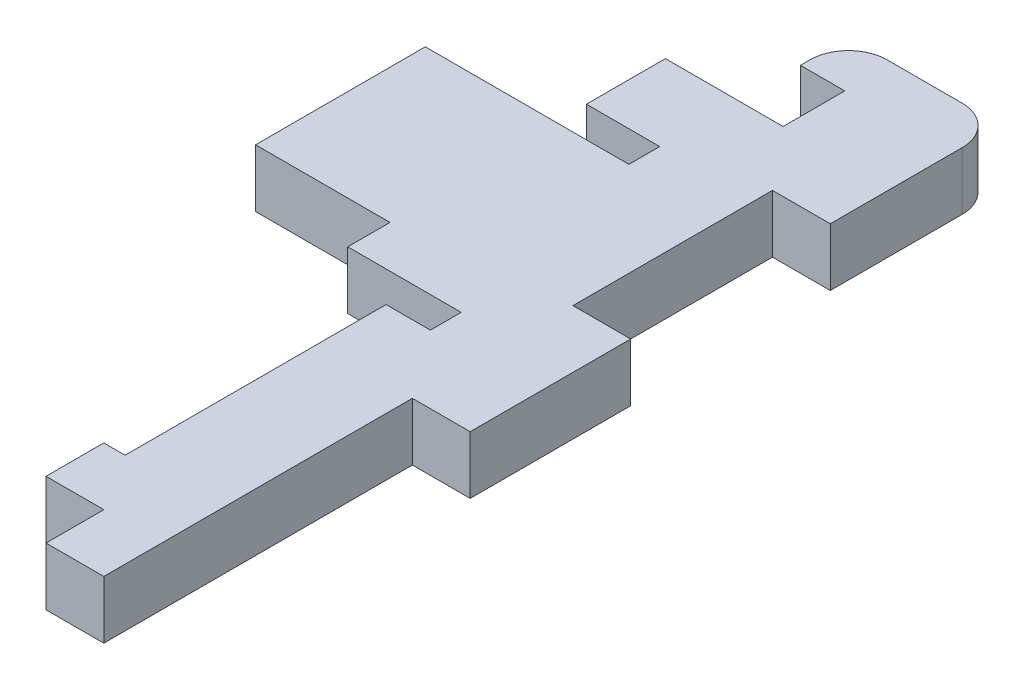
ISO-10303-21;
HEADER;
FILE_DESCRIPTION(('STEP AP214'),'2;1');
FILE_NAME('part.step','',(''),(''),'','','');
FILE_SCHEMA(('AUTOMOTIVE_DESIGN { 1 0 10303 214 1 1 1 1 }'));
ENDSEC;
DATA;
#1=APPLICATION_CONTEXT('core data for automotive mechanical design processes');
#2=APPLICATION_PROTOCOL_DEFINITION('international standard','automotive_design',2000,#1);
#3=PRODUCT_CONTEXT('',#1,'mechanical');
#4=PRODUCT('Part','Part','',(#3));
#5=PRODUCT_RELATED_PRODUCT_CATEGORY('part','',(#4));
#6=PRODUCT_DEFINITION_FORMATION('','',#4);
#7=PRODUCT_DEFINITION_CONTEXT('part definition',#1,'design');
#8=PRODUCT_DEFINITION('design','',#6,#7);
#9=PRODUCT_DEFINITION_SHAPE('','',#8);
#10=(LENGTH_UNIT() NAMED_UNIT(*) SI_UNIT(.MILLI.,.METRE.));
#11=(NAMED_UNIT(*) PLANE_ANGLE_UNIT() SI_UNIT($,.RADIAN.));
#12=(NAMED_UNIT(*) SI_UNIT($,.STERADIAN.) SOLID_ANGLE_UNIT());
#13=UNCERTAINTY_MEASURE_WITH_UNIT(LENGTH_MEASURE(1.E-05),#10,'distance_accuracy_value','');
#14=(GEOMETRIC_REPRESENTATION_CONTEXT(3) GLOBAL_UNCERTAINTY_ASSIGNED_CONTEXT((#13)) GLOBAL_UNIT_ASSIGNED_CONTEXT((#10,
#11,#12)) REPRESENTATION_CONTEXT('',''));
#15=CARTESIAN_POINT('',(0.,0.,0.));
#16=DIRECTION('',(0.,0.,1.));
#17=DIRECTION('',(1.,0.,0.));
#18=AXIS2_PLACEMENT_3D('',#15,#16,#17);
#19=CARTESIAN_POINT('',(75.1952082309363,60.9,-12.6));
#20=DIRECTION('',(0.,0.,1.));
#21=DIRECTION('',(1.,0.,0.));
#22=AXIS2_PLACEMENT_3D('',#19,#20,#21);
#23=PLANE('',#22);
#24=DIRECTION('',(-1.,0.,0.));
#25=VECTOR('',#24,1.);
#26=CARTESIAN_POINT('',(75.1952082309363,57.9,-12.6));
#27=LINE('',#26,#25);
#28=CARTESIAN_POINT('',(79.,57.9,-12.6));
#29=VERTEX_POINT('',#28);
#30=CARTESIAN_POINT('',(75.1952082309363,57.9,-12.6));
#31=VERTEX_POINT('',#30);
#32=EDGE_CURVE('E265',#29,#31,#27,.T.);
#33=ORIENTED_EDGE('',*,*,#32,.F.);
#34=DIRECTION('',(0.,-1.,0.));
#35=VECTOR('',#34,1.);
#36=CARTESIAN_POINT('',(79.,60.9,-12.6));
#37=LINE('',#36,#35);
#38=CARTESIAN_POINT('',(79.,60.9,-12.6));
#39=VERTEX_POINT('',#38);
#40=EDGE_CURVE('E404',#39,#29,#37,.T.);
#41=ORIENTED_EDGE('',*,*,#40,.F.);
#42=DIRECTION('',(-1.,0.,0.));
#43=VECTOR('',#42,1.);
#44=CARTESIAN_POINT('',(75.1952082309363,60.9,-12.6));
#45=LINE('',#44,#43);
#46=CARTESIAN_POINT('',(75.1952082309363,60.9,-12.6));
#47=VERTEX_POINT('',#46);
#48=EDGE_CURVE('E293',#39,#47,#45,.T.);
#49=ORIENTED_EDGE('',*,*,#48,.T.);
#50=DIRECTION('',(0.,-1.,0.));
#51=VECTOR('',#50,1.);
#52=CARTESIAN_POINT('',(75.1952082309363,60.9,-12.6));
#53=LINE('',#52,#51);
#54=EDGE_CURVE('E347',#47,#31,#53,.T.);
#55=ORIENTED_EDGE('',*,*,#54,.T.);
#56=EDGE_LOOP('',(#33,#41,#49,#55));
#57=FACE_BOUND('',#56,.T.);
#58=ADVANCED_FACE('F32',(#57),#23,.T.);
#59=CARTESIAN_POINT('',(79.,60.9,-11.));
#60=DIRECTION('',(-1.,0.,0.));
#61=DIRECTION('',(0.,0.,1.));
#62=AXIS2_PLACEMENT_3D('',#59,#60,#61);
#63=PLANE('',#62);
#64=DIRECTION('',(0.,0.,-1.));
#65=VECTOR('',#64,1.);
#66=CARTESIAN_POINT('',(79.,57.9,-11.));
#67=LINE('',#66,#65);
#68=CARTESIAN_POINT('',(79.,57.9,-11.));
#69=VERTEX_POINT('',#68);
#70=EDGE_CURVE('E296',#69,#29,#67,.T.);
#71=ORIENTED_EDGE('',*,*,#70,.F.);
#72=DIRECTION('',(0.,-1.,0.));
#73=VECTOR('',#72,1.);
#74=CARTESIAN_POINT('',(79.,60.9,-11.));
#75=LINE('',#74,#73);
#76=CARTESIAN_POINT('',(79.,60.9,-11.));
#77=VERTEX_POINT('',#76);
#78=EDGE_CURVE('E407',#77,#69,#75,.T.);
#79=ORIENTED_EDGE('',*,*,#78,.F.);
#80=DIRECTION('',(0.,0.,-1.));
#81=VECTOR('',#80,1.);
#82=CARTESIAN_POINT('',(79.,60.9,-11.));
#83=LINE('',#82,#81);
#84=EDGE_CURVE('E344',#77,#39,#83,.T.);
#85=ORIENTED_EDGE('',*,*,#84,.T.);
#86=ORIENTED_EDGE('',*,*,#40,.T.);
#87=EDGE_LOOP('',(#71,#79,#85,#86));
#88=FACE_BOUND('',#87,.T.);
#89=ADVANCED_FACE('F561',(#88),#63,.T.);
#90=CARTESIAN_POINT('',(79.,60.9,-11.));
#91=DIRECTION('',(0.,0.,-1.));
#92=DIRECTION('',(-1.,0.,0.));
#93=AXIS2_PLACEMENT_3D('',#90,#91,#92);
#94=PLANE('',#93);
#95=DIRECTION('',(1.,0.,0.));
#96=VECTOR('',#95,1.);
#97=CARTESIAN_POINT('',(79.,57.9,-11.));
#98=LINE('',#97,#96);
#99=CARTESIAN_POINT('',(68.4357503794786,57.9,-11.));
#100=VERTEX_POINT('',#99);
#101=EDGE_CURVE('E399',#100,#69,#98,.T.);
#102=ORIENTED_EDGE('',*,*,#101,.F.);
#103=DIRECTION('',(0.,-1.,0.));
#104=VECTOR('',#103,1.);
#105=CARTESIAN_POINT('',(68.4357503794786,60.9,-11.));
#106=LINE('',#105,#104);
#107=CARTESIAN_POINT('',(68.4357503794786,60.9,-11.));
#108=VERTEX_POINT('',#107);
#109=EDGE_CURVE('E409',#108,#100,#106,.T.);
#110=ORIENTED_EDGE('',*,*,#109,.F.);
#111=DIRECTION('',(1.,0.,0.));
#112=VECTOR('',#111,1.);
#113=CARTESIAN_POINT('',(79.,60.9,-11.));
#114=LINE('',#113,#112);
#115=EDGE_CURVE('E341',#108,#77,#114,.T.);
#116=ORIENTED_EDGE('',*,*,#115,.T.);
#117=ORIENTED_EDGE('',*,*,#78,.T.);
#118=EDGE_LOOP('',(#102,#110,#116,#117));
#119=FACE_BOUND('',#118,.T.);
#120=ADVANCED_FACE('F558',(#119),#94,.T.);
#121=CARTESIAN_POINT('',(68.4357503794786,60.9,-11.));
#122=DIRECTION('',(-1.,0.,0.));
#123=DIRECTION('',(0.,0.,1.));
#124=AXIS2_PLACEMENT_3D('',#121,#122,#123);
#125=PLANE('',#124);
#126=DIRECTION('',(0.,0.,-1.));
#127=VECTOR('',#126,1.);
#128=CARTESIAN_POINT('',(68.4357503794786,57.9,-11.));
#129=LINE('',#128,#127);
#130=CARTESIAN_POINT('',(68.4357503794786,57.9,-2.19236692361591));
#131=VERTEX_POINT('',#130);
#132=EDGE_CURVE('E396',#131,#100,#129,.T.);
#133=ORIENTED_EDGE('',*,*,#132,.F.);
#134=DIRECTION('',(0.,-1.,0.));
#135=VECTOR('',#134,1.);
#136=CARTESIAN_POINT('',(68.4357503794786,60.9,-2.19236692361591));
#137=LINE('',#136,#135);
#138=CARTESIAN_POINT('',(68.4357503794786,60.9,-2.19236692361591));
#139=VERTEX_POINT('',#138);
#140=EDGE_CURVE('E411',#139,#131,#137,.T.);
#141=ORIENTED_EDGE('',*,*,#140,.F.);
#142=DIRECTION('',(0.,0.,-1.));
#143=VECTOR('',#142,1.);
#144=CARTESIAN_POINT('',(68.4357503794786,60.9,-11.));
#145=LINE('',#144,#143);
#146=EDGE_CURVE('E338',#139,#108,#145,.T.);
#147=ORIENTED_EDGE('',*,*,#146,.T.);
#148=ORIENTED_EDGE('',*,*,#109,.T.);
#149=EDGE_LOOP('',(#133,#141,#147,#148));
#150=FACE_BOUND('',#149,.T.);
#151=ADVANCED_FACE('F554',(#150),#125,.T.);
#152=CARTESIAN_POINT('',(68.4357503794786,60.9,-2.19236692361591));
#153=DIRECTION('',(0.,0.,1.));
#154=DIRECTION('',(1.,0.,0.));
#155=AXIS2_PLACEMENT_3D('',#152,#153,#154);
#156=PLANE('',#155);
#157=DIRECTION('',(-1.,0.,0.));
#158=VECTOR('',#157,1.);
#159=CARTESIAN_POINT('',(68.4357503794786,57.9,-2.19236692361591));
#160=LINE('',#159,#158);
#161=CARTESIAN_POINT('',(75.4111167021012,57.9,-2.19236692361591));
#162=VERTEX_POINT('',#161);
#163=EDGE_CURVE('E393',#162,#131,#160,.T.);
#164=ORIENTED_EDGE('',*,*,#163,.F.);
#165=DIRECTION('',(0.,-1.,0.));
#166=VECTOR('',#165,1.);
#167=CARTESIAN_POINT('',(75.4111167021012,60.9,-2.19236692361591));
#168=LINE('',#167,#166);
#169=CARTESIAN_POINT('',(75.4111167021012,60.9,-2.19236692361591));
#170=VERTEX_POINT('',#169);
#171=EDGE_CURVE('E413',#170,#162,#168,.T.);
#172=ORIENTED_EDGE('',*,*,#171,.F.);
#173=DIRECTION('',(-1.,0.,0.));
#174=VECTOR('',#173,1.);
#175=CARTESIAN_POINT('',(68.4357503794786,60.9,-2.19236692361591));
#176=LINE('',#175,#174);
#177=EDGE_CURVE('E335',#170,#139,#176,.T.);
#178=ORIENTED_EDGE('',*,*,#177,.T.);
#179=ORIENTED_EDGE('',*,*,#140,.T.);
#180=EDGE_LOOP('',(#164,#172,#178,#179));
#181=FACE_BOUND('',#180,.T.);
#182=ADVANCED_FACE('F552',(#181),#156,.T.);
#183=CARTESIAN_POINT('',(75.4111167021012,60.9,-2.19236692361591));
#184=DIRECTION('',(-1.,0.,0.));
#185=DIRECTION('',(0.,0.,1.));
#186=AXIS2_PLACEMENT_3D('',#183,#184,#185);
#187=PLANE('',#186);
#188=DIRECTION('',(0.,0.,-1.));
#189=VECTOR('',#188,1.);
#190=CARTESIAN_POINT('',(75.4111167021012,57.9,-2.19236692361591));
#191=LINE('',#190,#189);
#192=CARTESIAN_POINT('',(75.4111167021012,57.9,0.));
#193=VERTEX_POINT('',#192);
#194=EDGE_CURVE('E390',#193,#162,#191,.T.);
#195=ORIENTED_EDGE('',*,*,#194,.F.);
#196=DIRECTION('',(0.,-1.,0.));
#197=VECTOR('',#196,1.);
#198=CARTESIAN_POINT('',(75.4111167021012,60.9,0.));
#199=LINE('',#198,#197);
#200=CARTESIAN_POINT('',(75.4111167021012,60.9,0.));
#201=VERTEX_POINT('',#200);
#202=EDGE_CURVE('E415',#201,#193,#199,.T.);
#203=ORIENTED_EDGE('',*,*,#202,.F.);
#204=DIRECTION('',(0.,0.,-1.));
#205=VECTOR('',#204,1.);
#206=CARTESIAN_POINT('',(75.4111167021012,60.9,-2.19236692361591));
#207=LINE('',#206,#205);
#208=EDGE_CURVE('E332',#201,#170,#207,.T.);
#209=ORIENTED_EDGE('',*,*,#208,.T.);
#210=ORIENTED_EDGE('',*,*,#171,.T.);
#211=EDGE_LOOP('',(#195,#203,#209,#210));
#212=FACE_BOUND('',#211,.T.);
#213=ADVANCED_FACE('F548',(#212),#187,.T.);
#214=CARTESIAN_POINT('',(75.4111167021012,60.9,0.));
#215=DIRECTION('',(0.,0.,1.));
#216=DIRECTION('',(1.,0.,0.));
#217=AXIS2_PLACEMENT_3D('',#214,#215,#216);
#218=PLANE('',#217);
#219=DIRECTION('',(-1.,0.,0.));
#220=VECTOR('',#219,1.);
#221=CARTESIAN_POINT('',(75.4111167021012,57.9,0.));
#222=LINE('',#221,#220);
#223=CARTESIAN_POINT('',(81.3,57.9,0.));
#224=VERTEX_POINT('',#223);
#225=EDGE_CURVE('E387',#224,#193,#222,.T.);
#226=ORIENTED_EDGE('',*,*,#225,.F.);
#227=DIRECTION('',(0.,-1.,0.));
#228=VECTOR('',#227,1.);
#229=CARTESIAN_POINT('',(81.3,60.9,0.));
#230=LINE('',#229,#228);
#231=CARTESIAN_POINT('',(81.3,60.9,0.));
#232=VERTEX_POINT('',#231);
#233=EDGE_CURVE('E417',#232,#224,#230,.T.);
#234=ORIENTED_EDGE('',*,*,#233,.F.);
#235=DIRECTION('',(-1.,0.,0.));
#236=VECTOR('',#235,1.);
#237=CARTESIAN_POINT('',(81.3,60.9,0.));
#238=LINE('',#237,#236);
#239=EDGE_CURVE('E330',#232,#201,#238,.T.);
#240=ORIENTED_EDGE('',*,*,#239,.T.);
#241=ORIENTED_EDGE('',*,*,#202,.T.);
#242=EDGE_LOOP('',(#226,#234,#240,#241));
#243=FACE_BOUND('',#242,.T.);
#244=ADVANCED_FACE('F541',(#243),#218,.T.);
#245=CARTESIAN_POINT('',(81.3,60.9,1.6));
#246=DIRECTION('',(-1.,0.,0.));
#247=DIRECTION('',(0.,0.,1.));
#248=AXIS2_PLACEMENT_3D('',#245,#246,#247);
#249=PLANE('',#248);
#250=DIRECTION('',(0.,0.,-1.));
#251=VECTOR('',#250,1.);
#252=CARTESIAN_POINT('',(81.3,57.9,1.6));
#253=LINE('',#252,#251);
#254=CARTESIAN_POINT('',(81.3,57.9,1.6));
#255=VERTEX_POINT('',#254);
#256=EDGE_CURVE('E384',#255,#224,#253,.T.);
#257=ORIENTED_EDGE('',*,*,#256,.F.);
#258=DIRECTION('',(0.,-1.,0.));
#259=VECTOR('',#258,1.);
#260=CARTESIAN_POINT('',(81.3,60.9,1.6));
#261=LINE('',#260,#259);
#262=CARTESIAN_POINT('',(81.3,60.9,1.6));
#263=VERTEX_POINT('',#262);
#264=EDGE_CURVE('E420',#263,#255,#261,.T.);
#265=ORIENTED_EDGE('',*,*,#264,.F.);
#266=DIRECTION('',(0.,0.,-1.));
#267=VECTOR('',#266,1.);
#268=CARTESIAN_POINT('',(81.3,60.9,1.6));
#269=LINE('',#268,#267);
#270=EDGE_CURVE('E327',#263,#232,#269,.T.);
#271=ORIENTED_EDGE('',*,*,#270,.T.);
#272=ORIENTED_EDGE('',*,*,#233,.T.);
#273=EDGE_LOOP('',(#257,#265,#271,#272));
#274=FACE_BOUND('',#273,.T.);
#275=ADVANCED_FACE('F538',(#274),#249,.T.);
#276=CARTESIAN_POINT('',(79.,60.9,1.6));
#277=DIRECTION('',(0.,0.,-1.));
#278=DIRECTION('',(-1.,0.,0.));
#279=AXIS2_PLACEMENT_3D('',#276,#277,#278);
#280=PLANE('',#279);
#281=DIRECTION('',(1.,0.,0.));
#282=VECTOR('',#281,1.);
#283=CARTESIAN_POINT('',(79.,57.9,1.6));
#284=LINE('',#283,#282);
#285=CARTESIAN_POINT('',(79.,57.9,1.6));
#286=VERTEX_POINT('',#285);
#287=EDGE_CURVE('E381',#286,#255,#284,.T.);
#288=ORIENTED_EDGE('',*,*,#287,.F.);
#289=DIRECTION('',(0.,-1.,0.));
#290=VECTOR('',#289,1.);
#291=CARTESIAN_POINT('',(79.,60.9,1.6));
#292=LINE('',#291,#290);
#293=CARTESIAN_POINT('',(79.,60.9,1.6));
#294=VERTEX_POINT('',#293);
#295=EDGE_CURVE('E422',#294,#286,#292,.T.);
#296=ORIENTED_EDGE('',*,*,#295,.F.);
#297=DIRECTION('',(1.,0.,0.));
#298=VECTOR('',#297,1.);
#299=CARTESIAN_POINT('',(79.,60.9,1.6));
#300=LINE('',#299,#298);
#301=EDGE_CURVE('E324',#294,#263,#300,.T.);
#302=ORIENTED_EDGE('',*,*,#301,.T.);
#303=ORIENTED_EDGE('',*,*,#264,.T.);
#304=EDGE_LOOP('',(#288,#296,#302,#303));
#305=FACE_BOUND('',#304,.T.);
#306=ADVANCED_FACE('F534',(#305),#280,.T.);
#307=CARTESIAN_POINT('',(79.,60.9,15.3587472111622));
#308=DIRECTION('',(-1.,0.,0.));
#309=DIRECTION('',(0.,0.,1.));
#310=AXIS2_PLACEMENT_3D('',#307,#308,#309);
#311=PLANE('',#310);
#312=DIRECTION('',(0.,1.,0.));
#313=VECTOR('',#312,1.);
#314=CARTESIAN_POINT('',(79.,49.4147186257614,15.14));
#315=LINE('',#314,#313);
#316=CARTESIAN_POINT('',(79.,57.9,15.14));
#317=VERTEX_POINT('',#316);
#318=CARTESIAN_POINT('',(79.,60.9,15.14));
#319=VERTEX_POINT('',#318);
#320=EDGE_CURVE('E280',#317,#319,#315,.T.);
#321=ORIENTED_EDGE('',*,*,#320,.T.);
#322=DIRECTION('',(0.,0.,-1.));
#323=VECTOR('',#322,1.);
#324=CARTESIAN_POINT('',(79.,60.9,15.3587472111622));
#325=LINE('',#324,#323);
#326=EDGE_CURVE('E322',#319,#294,#325,.T.);
#327=ORIENTED_EDGE('',*,*,#326,.T.);
#328=ORIENTED_EDGE('',*,*,#295,.T.);
#329=DIRECTION('',(0.,0.,-1.));
#330=VECTOR('',#329,1.);
#331=CARTESIAN_POINT('',(79.,57.9,15.3587472111622));
#332=LINE('',#331,#330);
#333=EDGE_CURVE('E379',#317,#286,#332,.T.);
#334=ORIENTED_EDGE('',*,*,#333,.F.);
#335=EDGE_LOOP('',(#321,#327,#328,#334));
#336=FACE_BOUND('',#335,.T.);
#337=ADVANCED_FACE('F529',(#336),#311,.T.);
#338=CARTESIAN_POINT('',(83.894661100132,60.9,5.12999479698806));
#339=DIRECTION('',(1.,0.,0.));
#340=DIRECTION('',(0.,0.,-1.));
#341=AXIS2_PLACEMENT_3D('',#338,#339,#340);
#342=PLANE('',#341);
#343=DIRECTION('',(0.,0.,1.));
#344=VECTOR('',#343,1.);
#345=CARTESIAN_POINT('',(83.894661100132,57.9,5.12999479698806));
#346=LINE('',#345,#344);
#347=CARTESIAN_POINT('',(83.894661100132,57.9,5.12999479698806));
#348=VERTEX_POINT('',#347);
#349=CARTESIAN_POINT('',(83.894661100132,57.9,21.14));
#350=VERTEX_POINT('',#349);
#351=EDGE_CURVE('E377',#348,#350,#346,.T.);
#352=ORIENTED_EDGE('',*,*,#351,.F.);
#353=DIRECTION('',(0.,-1.,0.));
#354=VECTOR('',#353,1.);
#355=CARTESIAN_POINT('',(83.894661100132,60.9,5.12999479698806));
#356=LINE('',#355,#354);
#357=CARTESIAN_POINT('',(83.894661100132,60.9,5.12999479698806));
#358=VERTEX_POINT('',#357);
#359=EDGE_CURVE('E425',#358,#348,#356,.T.);
#360=ORIENTED_EDGE('',*,*,#359,.F.);
#361=DIRECTION('',(0.,0.,1.));
#362=VECTOR('',#361,1.);
#363=CARTESIAN_POINT('',(83.894661100132,60.9,5.12999479698806));
#364=LINE('',#363,#362);
#365=CARTESIAN_POINT('',(83.894661100132,60.9,21.14));
#366=VERTEX_POINT('',#365);
#367=EDGE_CURVE('E320',#358,#366,#364,.T.);
#368=ORIENTED_EDGE('',*,*,#367,.T.);
#369=DIRECTION('',(0.,1.,0.));
#370=VECTOR('',#369,1.);
#371=CARTESIAN_POINT('',(83.894661100132,49.4147186257614,21.14));
#372=LINE('',#371,#370);
#373=EDGE_CURVE('E257',#350,#366,#372,.T.);
#374=ORIENTED_EDGE('',*,*,#373,.F.);
#375=EDGE_LOOP('',(#352,#360,#368,#374));
#376=FACE_BOUND('',#375,.T.);
#377=ADVANCED_FACE('F502',(#376),#342,.T.);
#378=CARTESIAN_POINT('',(83.894661100132,60.9,5.12999479698806));
#379=DIRECTION('',(0.,0.,1.));
#380=DIRECTION('',(1.,0.,0.));
#381=AXIS2_PLACEMENT_3D('',#378,#379,#380);
#382=PLANE('',#381);
#383=DIRECTION('',(-1.,0.,0.));
#384=VECTOR('',#383,1.);
#385=CARTESIAN_POINT('',(83.894661100132,57.9,5.12999479698806));
#386=LINE('',#385,#384);
#387=CARTESIAN_POINT('',(86.894661100132,57.9,5.12999479698806));
#388=VERTEX_POINT('',#387);
#389=EDGE_CURVE('E374',#388,#348,#386,.T.);
#390=ORIENTED_EDGE('',*,*,#389,.F.);
#391=DIRECTION('',(0.,-1.,0.));
#392=VECTOR('',#391,1.);
#393=CARTESIAN_POINT('',(86.894661100132,60.9,5.12999479698806));
#394=LINE('',#393,#392);
#395=CARTESIAN_POINT('',(86.894661100132,60.9,5.12999479698806));
#396=VERTEX_POINT('',#395);
#397=EDGE_CURVE('E427',#396,#388,#394,.T.);
#398=ORIENTED_EDGE('',*,*,#397,.F.);
#399=DIRECTION('',(-1.,0.,0.));
#400=VECTOR('',#399,1.);
#401=CARTESIAN_POINT('',(83.894661100132,60.9,5.12999479698806));
#402=LINE('',#401,#400);
#403=EDGE_CURVE('E317',#396,#358,#402,.T.);
#404=ORIENTED_EDGE('',*,*,#403,.T.);
#405=ORIENTED_EDGE('',*,*,#359,.T.);
#406=EDGE_LOOP('',(#390,#398,#404,#405));
#407=FACE_BOUND('',#406,.T.);
#408=ADVANCED_FACE('F497',(#407),#382,.T.);
#409=CARTESIAN_POINT('',(86.894661100132,60.9,-3.20045589876372));
#410=DIRECTION('',(1.,0.,0.));
#411=DIRECTION('',(0.,0.,-1.));
#412=AXIS2_PLACEMENT_3D('',#409,#410,#411);
#413=PLANE('',#412);
#414=DIRECTION('',(0.,0.,1.));
#415=VECTOR('',#414,1.);
#416=CARTESIAN_POINT('',(86.894661100132,57.9,-3.20045589876372));
#417=LINE('',#416,#415);
#418=CARTESIAN_POINT('',(86.894661100132,57.9,-3.20045589876372));
#419=VERTEX_POINT('',#418);
#420=EDGE_CURVE('E371',#419,#388,#417,.T.);
#421=ORIENTED_EDGE('',*,*,#420,.F.);
#422=DIRECTION('',(0.,-1.,0.));
#423=VECTOR('',#422,1.);
#424=CARTESIAN_POINT('',(86.894661100132,60.9,-3.20045589876372));
#425=LINE('',#424,#423);
#426=CARTESIAN_POINT('',(86.894661100132,60.9,-3.20045589876372));
#427=VERTEX_POINT('',#426);
#428=EDGE_CURVE('E429',#427,#419,#425,.T.);
#429=ORIENTED_EDGE('',*,*,#428,.F.);
#430=DIRECTION('',(0.,0.,1.));
#431=VECTOR('',#430,1.);
#432=CARTESIAN_POINT('',(86.894661100132,60.9,-3.20045589876372));
#433=LINE('',#432,#431);
#434=EDGE_CURVE('E314',#427,#396,#433,.T.);
#435=ORIENTED_EDGE('',*,*,#434,.T.);
#436=ORIENTED_EDGE('',*,*,#397,.T.);
#437=EDGE_LOOP('',(#421,#429,#435,#436));
#438=FACE_BOUND('',#437,.T.);
#439=ADVANCED_FACE('F492',(#438),#413,.T.);
#440=CARTESIAN_POINT('',(83.894661100132,60.9,-3.20045589876372));
#441=DIRECTION('',(0.,0.,-1.));
#442=DIRECTION('',(-1.,0.,0.));
#443=AXIS2_PLACEMENT_3D('',#440,#441,#442);
#444=PLANE('',#443);
#445=DIRECTION('',(1.,0.,0.));
#446=VECTOR('',#445,1.);
#447=CARTESIAN_POINT('',(83.894661100132,57.9,-3.20045589876372));
#448=LINE('',#447,#446);
#449=CARTESIAN_POINT('',(83.894661100132,57.9,-3.20045589876372));
#450=VERTEX_POINT('',#449);
#451=EDGE_CURVE('E368',#450,#419,#448,.T.);
#452=ORIENTED_EDGE('',*,*,#451,.F.);
#453=DIRECTION('',(0.,-1.,0.));
#454=VECTOR('',#453,1.);
#455=CARTESIAN_POINT('',(83.894661100132,60.9,-3.20045589876372));
#456=LINE('',#455,#454);
#457=CARTESIAN_POINT('',(83.894661100132,60.9,-3.20045589876372));
#458=VERTEX_POINT('',#457);
#459=EDGE_CURVE('E431',#458,#450,#456,.T.);
#460=ORIENTED_EDGE('',*,*,#459,.F.);
#461=DIRECTION('',(1.,0.,0.));
#462=VECTOR('',#461,1.);
#463=CARTESIAN_POINT('',(83.894661100132,60.9,-3.20045589876372));
#464=LINE('',#463,#462);
#465=EDGE_CURVE('E311',#458,#427,#464,.T.);
#466=ORIENTED_EDGE('',*,*,#465,.T.);
#467=ORIENTED_EDGE('',*,*,#428,.T.);
#468=EDGE_LOOP('',(#452,#460,#466,#467));
#469=FACE_BOUND('',#468,.T.);
#470=ADVANCED_FACE('F488',(#469),#444,.T.);
#471=CARTESIAN_POINT('',(83.894661100132,60.9,-13.5554998767088));
#472=DIRECTION('',(1.,0.,0.));
#473=DIRECTION('',(0.,0.,-1.));
#474=AXIS2_PLACEMENT_3D('',#471,#472,#473);
#475=PLANE('',#474);
#476=DIRECTION('',(0.,0.,1.));
#477=VECTOR('',#476,1.);
#478=CARTESIAN_POINT('',(83.894661100132,57.9,-13.5554998767088));
#479=LINE('',#478,#477);
#480=CARTESIAN_POINT('',(83.894661100132,57.9,-13.5554998767088));
#481=VERTEX_POINT('',#480);
#482=EDGE_CURVE('E365',#481,#450,#479,.T.);
#483=ORIENTED_EDGE('',*,*,#482,.F.);
#484=DIRECTION('',(0.,-1.,0.));
#485=VECTOR('',#484,1.);
#486=CARTESIAN_POINT('',(83.894661100132,60.9,-13.5554998767088));
#487=LINE('',#486,#485);
#488=CARTESIAN_POINT('',(83.894661100132,60.9,-13.5554998767088));
#489=VERTEX_POINT('',#488);
#490=EDGE_CURVE('E433',#489,#481,#487,.T.);
#491=ORIENTED_EDGE('',*,*,#490,.F.);
#492=DIRECTION('',(0.,0.,1.));
#493=VECTOR('',#492,1.);
#494=CARTESIAN_POINT('',(83.894661100132,60.9,-13.5554998767088));
#495=LINE('',#494,#493);
#496=EDGE_CURVE('E308',#489,#458,#495,.T.);
#497=ORIENTED_EDGE('',*,*,#496,.T.);
#498=ORIENTED_EDGE('',*,*,#459,.T.);
#499=EDGE_LOOP('',(#483,#491,#497,#498));
#500=FACE_BOUND('',#499,.T.);
#501=ADVANCED_FACE('F484',(#500),#475,.T.);
#502=CARTESIAN_POINT('',(86.894661100132,60.9,-13.5554998767088));
#503=DIRECTION('',(0.,0.,1.));
#504=DIRECTION('',(1.,0.,0.));
#505=AXIS2_PLACEMENT_3D('',#502,#503,#504);
#506=PLANE('',#505);
#507=DIRECTION('',(-1.,0.,0.));
#508=VECTOR('',#507,1.);
#509=CARTESIAN_POINT('',(86.894661100132,57.9,-13.5554998767088));
#510=LINE('',#509,#508);
#511=CARTESIAN_POINT('',(86.894661100132,57.9,-13.5554998767088));
#512=VERTEX_POINT('',#511);
#513=EDGE_CURVE('E362',#512,#481,#510,.T.);
#514=ORIENTED_EDGE('',*,*,#513,.F.);
#515=DIRECTION('',(0.,-1.,0.));
#516=VECTOR('',#515,1.);
#517=CARTESIAN_POINT('',(86.894661100132,60.9,-13.5554998767088));
#518=LINE('',#517,#516);
#519=CARTESIAN_POINT('',(86.894661100132,60.9,-13.5554998767088));
#520=VERTEX_POINT('',#519);
#521=EDGE_CURVE('E435',#520,#512,#518,.T.);
#522=ORIENTED_EDGE('',*,*,#521,.F.);
#523=DIRECTION('',(-1.,0.,0.));
#524=VECTOR('',#523,1.);
#525=CARTESIAN_POINT('',(86.894661100132,60.9,-13.5554998767088));
#526=LINE('',#525,#524);
#527=EDGE_CURVE('E305',#520,#489,#526,.T.);
#528=ORIENTED_EDGE('',*,*,#527,.T.);
#529=ORIENTED_EDGE('',*,*,#490,.T.);
#530=EDGE_LOOP('',(#514,#522,#528,#529));
#531=FACE_BOUND('',#530,.T.);
#532=ADVANCED_FACE('F480',(#531),#506,.T.);
#533=CARTESIAN_POINT('',(86.894661100132,60.9,-15.0301262996702));
#534=DIRECTION('',(1.,0.,0.));
#535=DIRECTION('',(0.,0.,-1.));
#536=AXIS2_PLACEMENT_3D('',#533,#534,#535);
#537=PLANE('',#536);
#538=DIRECTION('',(0.,0.,1.));
#539=VECTOR('',#538,1.);
#540=CARTESIAN_POINT('',(86.894661100132,57.9,-15.0301262996702));
#541=LINE('',#540,#539);
#542=CARTESIAN_POINT('',(86.894661100132,57.9,-20.39560780373));
#543=VERTEX_POINT('',#542);
#544=EDGE_CURVE('E360',#543,#512,#541,.T.);
#545=ORIENTED_EDGE('',*,*,#544,.F.);
#546=DIRECTION('',(0.,-1.,0.));
#547=VECTOR('',#546,1.);
#548=CARTESIAN_POINT('',(86.894661100132,60.9,-20.39560780373));
#549=LINE('',#548,#547);
#550=CARTESIAN_POINT('',(86.894661100132,60.9,-20.39560780373));
#551=VERTEX_POINT('',#550);
#552=EDGE_CURVE('E447',#543,#551,#549,.F.);
#553=ORIENTED_EDGE('',*,*,#552,.T.);
#554=DIRECTION('',(0.,0.,1.));
#555=VECTOR('',#554,1.);
#556=CARTESIAN_POINT('',(86.894661100132,60.9,-22.39560780373));
#557=LINE('',#556,#555);
#558=EDGE_CURVE('E303',#551,#520,#557,.T.);
#559=ORIENTED_EDGE('',*,*,#558,.T.);
#560=ORIENTED_EDGE('',*,*,#521,.T.);
#561=EDGE_LOOP('',(#545,#553,#559,#560));
#562=FACE_BOUND('',#561,.T.);
#563=ADVANCED_FACE('F474',(#562),#537,.T.);
#564=CARTESIAN_POINT('',(79.,60.9,-22.39560780373));
#565=DIRECTION('',(0.,0.,-1.));
#566=DIRECTION('',(-1.,0.,0.));
#567=AXIS2_PLACEMENT_3D('',#564,#565,#566);
#568=PLANE('',#567);
#569=DIRECTION('',(1.,0.,0.));
#570=VECTOR('',#569,1.);
#571=CARTESIAN_POINT('',(79.,60.9,-22.39560780373));
#572=LINE('',#571,#570);
#573=CARTESIAN_POINT('',(81.,60.9,-22.39560780373));
#574=VERTEX_POINT('',#573);
#575=CARTESIAN_POINT('',(84.894661100132,60.9,-22.39560780373));
#576=VERTEX_POINT('',#575);
#577=EDGE_CURVE('E300',#574,#576,#572,.T.);
#578=ORIENTED_EDGE('',*,*,#577,.T.);
#579=DIRECTION('',(0.,-1.,0.));
#580=VECTOR('',#579,1.);
#581=CARTESIAN_POINT('',(84.894661100132,60.9,-22.39560780373));
#582=LINE('',#581,#580);
#583=CARTESIAN_POINT('',(84.894661100132,57.9,-22.39560780373));
#584=VERTEX_POINT('',#583);
#585=EDGE_CURVE('E440',#576,#584,#582,.T.);
#586=ORIENTED_EDGE('',*,*,#585,.T.);
#587=DIRECTION('',(1.,0.,0.));
#588=VECTOR('',#587,1.);
#589=CARTESIAN_POINT('',(79.,57.9,-22.39560780373));
#590=LINE('',#589,#588);
#591=CARTESIAN_POINT('',(81.,57.9,-22.39560780373));
#592=VERTEX_POINT('',#591);
#593=EDGE_CURVE('E357',#592,#584,#590,.T.);
#594=ORIENTED_EDGE('',*,*,#593,.F.);
#595=DIRECTION('',(0.,-1.,0.));
#596=VECTOR('',#595,1.);
#597=CARTESIAN_POINT('',(81.,60.9,-22.39560780373));
#598=LINE('',#597,#596);
#599=EDGE_CURVE('E406',#592,#574,#598,.F.);
#600=ORIENTED_EDGE('',*,*,#599,.T.);
#601=EDGE_LOOP('',(#578,#586,#594,#600));
#602=FACE_BOUND('',#601,.T.);
#603=ADVANCED_FACE('F465',(#602),#568,.T.);
#604=CARTESIAN_POINT('',(79.,60.9,-19.8));
#605=DIRECTION('',(-1.,0.,0.));
#606=DIRECTION('',(0.,0.,1.));
#607=AXIS2_PLACEMENT_3D('',#604,#605,#606);
#608=PLANE('',#607);
#609=DIRECTION('',(0.,-1.,0.));
#610=VECTOR('',#609,1.);
#611=CARTESIAN_POINT('',(79.,60.9,-19.9));
#612=LINE('',#611,#610);
#613=CARTESIAN_POINT('',(79.,60.9,-19.9));
#614=VERTEX_POINT('',#613);
#615=CARTESIAN_POINT('',(79.,57.9,-19.9));
#616=VERTEX_POINT('',#615);
#617=EDGE_CURVE('E47',#614,#616,#612,.T.);
#618=ORIENTED_EDGE('',*,*,#617,.F.);
#619=DIRECTION('',(0.,0.,-1.));
#620=VECTOR('',#619,1.);
#621=CARTESIAN_POINT('',(79.,60.9,-19.8));
#622=LINE('',#621,#620);
#623=CARTESIAN_POINT('',(79.,60.9,-20.39560780373));
#624=VERTEX_POINT('',#623);
#625=EDGE_CURVE('E54',#614,#624,#622,.T.);
#626=ORIENTED_EDGE('',*,*,#625,.T.);
#627=DIRECTION('',(0.,-1.,0.));
#628=VECTOR('',#627,1.);
#629=CARTESIAN_POINT('',(79.,60.9,-20.39560780373));
#630=LINE('',#629,#628);
#631=CARTESIAN_POINT('',(79.,57.9,-20.39560780373));
#632=VERTEX_POINT('',#631);
#633=EDGE_CURVE('E453',#624,#632,#630,.T.);
#634=ORIENTED_EDGE('',*,*,#633,.T.);
#635=DIRECTION('',(0.,0.,-1.));
#636=VECTOR('',#635,1.);
#637=CARTESIAN_POINT('',(79.,57.9,-19.8));
#638=LINE('',#637,#636);
#639=EDGE_CURVE('E355',#616,#632,#638,.T.);
#640=ORIENTED_EDGE('',*,*,#639,.F.);
#641=EDGE_LOOP('',(#618,#626,#634,#640));
#642=FACE_BOUND('',#641,.T.);
#643=ADVANCED_FACE('F458',(#642),#608,.T.);
#644=CARTESIAN_POINT('',(81.3,60.9,-19.8));
#645=DIRECTION('',(-1.,0.,0.));
#646=DIRECTION('',(0.,0.,1.));
#647=AXIS2_PLACEMENT_3D('',#644,#645,#646);
#648=PLANE('',#647);
#649=DIRECTION('',(0.,0.,-1.));
#650=VECTOR('',#649,1.);
#651=CARTESIAN_POINT('',(81.3,57.9,-19.8));
#652=LINE('',#651,#650);
#653=CARTESIAN_POINT('',(81.3,57.9,-16.7));
#654=VERTEX_POINT('',#653);
#655=CARTESIAN_POINT('',(81.3,57.9,-19.9));
#656=VERTEX_POINT('',#655);
#657=EDGE_CURVE('E353',#654,#656,#652,.T.);
#658=ORIENTED_EDGE('',*,*,#657,.F.);
#659=DIRECTION('',(0.,-1.,0.));
#660=VECTOR('',#659,1.);
#661=CARTESIAN_POINT('',(81.3,72.14,-16.7));
#662=LINE('',#661,#660);
#663=CARTESIAN_POINT('',(81.3,60.9,-16.7));
#664=VERTEX_POINT('',#663);
#665=EDGE_CURVE('E236',#664,#654,#662,.T.);
#666=ORIENTED_EDGE('',*,*,#665,.F.);
#667=DIRECTION('',(0.,0.,-1.));
#668=VECTOR('',#667,1.);
#669=CARTESIAN_POINT('',(81.3,60.9,-19.8));
#670=LINE('',#669,#668);
#671=CARTESIAN_POINT('',(81.3,60.9,-19.9));
#672=VERTEX_POINT('',#671);
#673=EDGE_CURVE('E231',#664,#672,#670,.T.);
#674=ORIENTED_EDGE('',*,*,#673,.T.);
#675=DIRECTION('',(0.,-1.,0.));
#676=VECTOR('',#675,1.);
#677=CARTESIAN_POINT('',(81.3,72.14,-19.9));
#678=LINE('',#677,#676);
#679=EDGE_CURVE('E234',#672,#656,#678,.T.);
#680=ORIENTED_EDGE('',*,*,#679,.T.);
#681=EDGE_LOOP('',(#658,#666,#674,#680));
#682=FACE_BOUND('',#681,.T.);
#683=ADVANCED_FACE('F233',(#682),#648,.T.);
#684=CARTESIAN_POINT('',(75.1952082309363,60.9,-12.6));
#685=DIRECTION('',(-1.,0.,0.));
#686=DIRECTION('',(0.,0.,1.));
#687=AXIS2_PLACEMENT_3D('',#684,#685,#686);
#688=PLANE('',#687);
#689=DIRECTION('',(0.,-1.,0.));
#690=VECTOR('',#689,1.);
#691=CARTESIAN_POINT('',(75.1952082309363,72.14,-16.7));
#692=LINE('',#691,#690);
#693=CARTESIAN_POINT('',(75.1952082309363,60.9,-16.7));
#694=VERTEX_POINT('',#693);
#695=CARTESIAN_POINT('',(75.1952082309363,57.9,-16.7));
#696=VERTEX_POINT('',#695);
#697=EDGE_CURVE('E251',#694,#696,#692,.T.);
#698=ORIENTED_EDGE('',*,*,#697,.T.);
#699=DIRECTION('',(0.,0.,-1.));
#700=VECTOR('',#699,1.);
#701=CARTESIAN_POINT('',(75.1952082309363,57.9,-12.6));
#702=LINE('',#701,#700);
#703=EDGE_CURVE('E350',#31,#696,#702,.T.);
#704=ORIENTED_EDGE('',*,*,#703,.F.);
#705=ORIENTED_EDGE('',*,*,#54,.F.);
#706=DIRECTION('',(0.,0.,-1.));
#707=VECTOR('',#706,1.);
#708=CARTESIAN_POINT('',(75.1952082309363,60.9,-12.6));
#709=LINE('',#708,#707);
#710=EDGE_CURVE('E241',#47,#694,#709,.T.);
#711=ORIENTED_EDGE('',*,*,#710,.T.);
#712=EDGE_LOOP('',(#698,#704,#705,#711));
#713=FACE_BOUND('',#712,.T.);
#714=ADVANCED_FACE('F569',(#713),#688,.T.);
#715=CARTESIAN_POINT('',(0.,60.9,0.));
#716=DIRECTION('',(0.,1.,0.));
#717=DIRECTION('',(0.,0.,1.));
#718=AXIS2_PLACEMENT_3D('',#715,#716,#717);
#719=PLANE('',#718);
#720=DIRECTION('',(1.,0.,0.));
#721=VECTOR('',#720,1.);
#722=CARTESIAN_POINT('',(0.,60.9,-16.7));
#723=LINE('',#722,#721);
#724=EDGE_CURVE('E247',#694,#664,#723,.T.);
#725=ORIENTED_EDGE('',*,*,#724,.F.);
#726=ORIENTED_EDGE('',*,*,#710,.F.);
#727=ORIENTED_EDGE('',*,*,#48,.F.);
#728=ORIENTED_EDGE('',*,*,#84,.F.);
#729=ORIENTED_EDGE('',*,*,#115,.F.);
#730=ORIENTED_EDGE('',*,*,#146,.F.);
#731=ORIENTED_EDGE('',*,*,#177,.F.);
#732=ORIENTED_EDGE('',*,*,#208,.F.);
#733=ORIENTED_EDGE('',*,*,#239,.F.);
#734=ORIENTED_EDGE('',*,*,#270,.F.);
#735=ORIENTED_EDGE('',*,*,#301,.F.);
#736=ORIENTED_EDGE('',*,*,#326,.F.);
#737=DIRECTION('',(-1.,0.,0.));
#738=VECTOR('',#737,1.);
#739=CARTESIAN_POINT('',(77.894661100132,60.9,15.14));
#740=LINE('',#739,#738);
#741=CARTESIAN_POINT('',(77.894661100132,60.9,15.14));
#742=VERTEX_POINT('',#741);
#743=EDGE_CURVE('E249',#319,#742,#740,.T.);
#744=ORIENTED_EDGE('',*,*,#743,.T.);
#745=DIRECTION('',(0.,0.,1.));
#746=VECTOR('',#745,1.);
#747=CARTESIAN_POINT('',(77.894661100132,60.9,18.14));
#748=LINE('',#747,#746);
#749=CARTESIAN_POINT('',(77.894661100132,60.9,18.14));
#750=VERTEX_POINT('',#749);
#751=EDGE_CURVE('E268',#742,#750,#748,.T.);
#752=ORIENTED_EDGE('',*,*,#751,.T.);
#753=DIRECTION('',(1.,0.,0.));
#754=VECTOR('',#753,1.);
#755=CARTESIAN_POINT('',(80.894661100132,60.9,18.14));
#756=LINE('',#755,#754);
#757=CARTESIAN_POINT('',(80.894661100132,60.9,18.14));
#758=VERTEX_POINT('',#757);
#759=EDGE_CURVE('E271',#750,#758,#756,.T.);
#760=ORIENTED_EDGE('',*,*,#759,.T.);
#761=DIRECTION('',(0.,0.,1.));
#762=VECTOR('',#761,1.);
#763=CARTESIAN_POINT('',(80.894661100132,60.9,21.14));
#764=LINE('',#763,#762);
#765=CARTESIAN_POINT('',(80.894661100132,60.9,21.14));
#766=VERTEX_POINT('',#765);
#767=EDGE_CURVE('E274',#758,#766,#764,.T.);
#768=ORIENTED_EDGE('',*,*,#767,.T.);
#769=DIRECTION('',(1.,0.,0.));
#770=VECTOR('',#769,1.);
#771=CARTESIAN_POINT('',(83.894661100132,60.9,21.14));
#772=LINE('',#771,#770);
#773=EDGE_CURVE('E277',#766,#366,#772,.T.);
#774=ORIENTED_EDGE('',*,*,#773,.T.);
#775=ORIENTED_EDGE('',*,*,#367,.F.);
#776=ORIENTED_EDGE('',*,*,#403,.F.);
#777=ORIENTED_EDGE('',*,*,#434,.F.);
#778=ORIENTED_EDGE('',*,*,#465,.F.);
#779=ORIENTED_EDGE('',*,*,#496,.F.);
#780=ORIENTED_EDGE('',*,*,#527,.F.);
#781=ORIENTED_EDGE('',*,*,#558,.F.);
#782=CARTESIAN_POINT('',(84.894661100132,60.9,-20.39560780373));
#783=DIRECTION('',(0.,1.,0.));
#784=DIRECTION('',(0.,0.,1.));
#785=AXIS2_PLACEMENT_3D('',#782,#783,#784);
#786=CIRCLE('',#785,2.);
#787=EDGE_CURVE('E451',#551,#576,#786,.T.);
#788=ORIENTED_EDGE('',*,*,#787,.T.);
#789=ORIENTED_EDGE('',*,*,#577,.F.);
#790=CARTESIAN_POINT('',(81.,60.9,-20.39560780373));
#791=DIRECTION('',(0.,1.,0.));
#792=DIRECTION('',(0.,0.,1.));
#793=AXIS2_PLACEMENT_3D('',#790,#791,#792);
#794=CIRCLE('',#793,2.);
#795=EDGE_CURVE('E449',#574,#624,#794,.T.);
#796=ORIENTED_EDGE('',*,*,#795,.T.);
#797=ORIENTED_EDGE('',*,*,#625,.F.);
#798=DIRECTION('',(-1.,0.,0.));
#799=VECTOR('',#798,1.);
#800=CARTESIAN_POINT('',(0.,60.9,-19.9));
#801=LINE('',#800,#799);
#802=EDGE_CURVE('E244',#672,#614,#801,.T.);
#803=ORIENTED_EDGE('',*,*,#802,.F.);
#804=ORIENTED_EDGE('',*,*,#673,.F.);
#805=EDGE_LOOP('',(#725,#726,#727,#728,#729,#730,#731,#732,#733,#734,#735,#736,#744,#752,#760,
#768,#774,#775,#776,#777,#778,#779,#780,#781,#788,#789,#796,#797,#803,#804));
#806=FACE_BOUND('',#805,.T.);
#807=ADVANCED_FACE('F246',(#806),#719,.T.);
#808=CARTESIAN_POINT('',(0.,57.9,0.));
#809=DIRECTION('',(0.,1.,0.));
#810=DIRECTION('',(0.,0.,1.));
#811=AXIS2_PLACEMENT_3D('',#808,#809,#810);
#812=PLANE('',#811);
#813=ORIENTED_EDGE('',*,*,#703,.T.);
#814=DIRECTION('',(1.,0.,0.));
#815=VECTOR('',#814,1.);
#816=CARTESIAN_POINT('',(0.,57.9,-16.7));
#817=LINE('',#816,#815);
#818=EDGE_CURVE('E11',#696,#654,#817,.T.);
#819=ORIENTED_EDGE('',*,*,#818,.T.);
#820=ORIENTED_EDGE('',*,*,#657,.T.);
#821=DIRECTION('',(-1.,0.,0.));
#822=VECTOR('',#821,1.);
#823=CARTESIAN_POINT('',(0.,57.9,-19.9));
#824=LINE('',#823,#822);
#825=EDGE_CURVE('E40',#656,#616,#824,.T.);
#826=ORIENTED_EDGE('',*,*,#825,.T.);
#827=ORIENTED_EDGE('',*,*,#639,.T.);
#828=CARTESIAN_POINT('',(81.,57.9,-20.39560780373));
#829=DIRECTION('',(0.,1.,0.));
#830=DIRECTION('',(0.,0.,1.));
#831=AXIS2_PLACEMENT_3D('',#828,#829,#830);
#832=CIRCLE('',#831,2.);
#833=EDGE_CURVE('E443',#632,#592,#832,.F.);
#834=ORIENTED_EDGE('',*,*,#833,.T.);
#835=ORIENTED_EDGE('',*,*,#593,.T.);
#836=CARTESIAN_POINT('',(84.894661100132,57.9,-20.39560780373));
#837=DIRECTION('',(0.,1.,0.));
#838=DIRECTION('',(0.,0.,1.));
#839=AXIS2_PLACEMENT_3D('',#836,#837,#838);
#840=CIRCLE('',#839,2.);
#841=EDGE_CURVE('E445',#584,#543,#840,.F.);
#842=ORIENTED_EDGE('',*,*,#841,.T.);
#843=ORIENTED_EDGE('',*,*,#544,.T.);
#844=ORIENTED_EDGE('',*,*,#513,.T.);
#845=ORIENTED_EDGE('',*,*,#482,.T.);
#846=ORIENTED_EDGE('',*,*,#451,.T.);
#847=ORIENTED_EDGE('',*,*,#420,.T.);
#848=ORIENTED_EDGE('',*,*,#389,.T.);
#849=ORIENTED_EDGE('',*,*,#351,.T.);
#850=DIRECTION('',(-1.,0.,0.));
#851=VECTOR('',#850,1.);
#852=CARTESIAN_POINT('',(83.894661100132,57.9,21.14));
#853=LINE('',#852,#851);
#854=CARTESIAN_POINT('',(80.894661100132,57.9,21.14));
#855=VERTEX_POINT('',#854);
#856=EDGE_CURVE('E263',#350,#855,#853,.T.);
#857=ORIENTED_EDGE('',*,*,#856,.T.);
#858=DIRECTION('',(0.,0.,-1.));
#859=VECTOR('',#858,1.);
#860=CARTESIAN_POINT('',(80.894661100132,57.9,21.14));
#861=LINE('',#860,#859);
#862=CARTESIAN_POINT('',(80.894661100132,57.9,18.14));
#863=VERTEX_POINT('',#862);
#864=EDGE_CURVE('E261',#855,#863,#861,.T.);
#865=ORIENTED_EDGE('',*,*,#864,.T.);
#866=DIRECTION('',(-1.,0.,0.));
#867=VECTOR('',#866,1.);
#868=CARTESIAN_POINT('',(80.894661100132,57.9,18.14));
#869=LINE('',#868,#867);
#870=CARTESIAN_POINT('',(77.894661100132,57.9,18.14));
#871=VERTEX_POINT('',#870);
#872=EDGE_CURVE('E259',#863,#871,#869,.T.);
#873=ORIENTED_EDGE('',*,*,#872,.T.);
#874=DIRECTION('',(0.,0.,-1.));
#875=VECTOR('',#874,1.);
#876=CARTESIAN_POINT('',(77.894661100132,57.9,18.14));
#877=LINE('',#876,#875);
#878=CARTESIAN_POINT('',(77.894661100132,57.9,15.14));
#879=VERTEX_POINT('',#878);
#880=EDGE_CURVE('E256',#871,#879,#877,.T.);
#881=ORIENTED_EDGE('',*,*,#880,.T.);
#882=DIRECTION('',(1.,0.,0.));
#883=VECTOR('',#882,1.);
#884=CARTESIAN_POINT('',(77.894661100132,57.9,15.14));
#885=LINE('',#884,#883);
#886=EDGE_CURVE('E254',#879,#317,#885,.T.);
#887=ORIENTED_EDGE('',*,*,#886,.T.);
#888=ORIENTED_EDGE('',*,*,#333,.T.);
#889=ORIENTED_EDGE('',*,*,#287,.T.);
#890=ORIENTED_EDGE('',*,*,#256,.T.);
#891=ORIENTED_EDGE('',*,*,#225,.T.);
#892=ORIENTED_EDGE('',*,*,#194,.T.);
#893=ORIENTED_EDGE('',*,*,#163,.T.);
#894=ORIENTED_EDGE('',*,*,#132,.T.);
#895=ORIENTED_EDGE('',*,*,#101,.T.);
#896=ORIENTED_EDGE('',*,*,#70,.T.);
#897=ORIENTED_EDGE('',*,*,#32,.T.);
#898=EDGE_LOOP('',(#813,#819,#820,#826,#827,#834,#835,#842,#843,#844,#845,#846,#847,#848,#849,
#857,#865,#873,#881,#887,#888,#889,#890,#891,#892,#893,#894,#895,#896,#897));
#899=FACE_BOUND('',#898,.T.);
#900=ADVANCED_FACE('F456',(#899),#812,.F.);
#901=CARTESIAN_POINT('',(83.894661100132,49.4147186257614,21.14));
#902=DIRECTION('',(0.,0.,1.));
#903=DIRECTION('',(1.,0.,0.));
#904=AXIS2_PLACEMENT_3D('',#901,#902,#903);
#905=PLANE('',#904);
#906=ORIENTED_EDGE('',*,*,#856,.F.);
#907=ORIENTED_EDGE('',*,*,#373,.T.);
#908=ORIENTED_EDGE('',*,*,#773,.F.);
#909=DIRECTION('',(0.,1.,0.));
#910=VECTOR('',#909,1.);
#911=CARTESIAN_POINT('',(80.894661100132,49.4147186257614,21.14));
#912=LINE('',#911,#910);
#913=EDGE_CURVE('E283',#855,#766,#912,.T.);
#914=ORIENTED_EDGE('',*,*,#913,.F.);
#915=EDGE_LOOP('',(#906,#907,#908,#914));
#916=FACE_BOUND('',#915,.T.);
#917=ADVANCED_FACE('F505',(#916),#905,.T.);
#918=CARTESIAN_POINT('',(80.894661100132,49.4147186257614,21.14));
#919=DIRECTION('',(-1.,0.,0.));
#920=DIRECTION('',(0.,0.,1.));
#921=AXIS2_PLACEMENT_3D('',#918,#919,#920);
#922=PLANE('',#921);
#923=ORIENTED_EDGE('',*,*,#864,.F.);
#924=ORIENTED_EDGE('',*,*,#913,.T.);
#925=ORIENTED_EDGE('',*,*,#767,.F.);
#926=DIRECTION('',(0.,1.,0.));
#927=VECTOR('',#926,1.);
#928=CARTESIAN_POINT('',(80.894661100132,49.4147186257614,18.14));
#929=LINE('',#928,#927);
#930=EDGE_CURVE('E285',#863,#758,#929,.T.);
#931=ORIENTED_EDGE('',*,*,#930,.F.);
#932=EDGE_LOOP('',(#923,#924,#925,#931));
#933=FACE_BOUND('',#932,.T.);
#934=ADVANCED_FACE('F512',(#933),#922,.T.);
#935=CARTESIAN_POINT('',(80.894661100132,49.4147186257614,18.14));
#936=DIRECTION('',(0.,0.,1.));
#937=DIRECTION('',(1.,0.,0.));
#938=AXIS2_PLACEMENT_3D('',#935,#936,#937);
#939=PLANE('',#938);
#940=ORIENTED_EDGE('',*,*,#872,.F.);
#941=ORIENTED_EDGE('',*,*,#930,.T.);
#942=ORIENTED_EDGE('',*,*,#759,.F.);
#943=DIRECTION('',(0.,1.,0.));
#944=VECTOR('',#943,1.);
#945=CARTESIAN_POINT('',(77.894661100132,49.4147186257614,18.14));
#946=LINE('',#945,#944);
#947=EDGE_CURVE('E287',#871,#750,#946,.T.);
#948=ORIENTED_EDGE('',*,*,#947,.F.);
#949=EDGE_LOOP('',(#940,#941,#942,#948));
#950=FACE_BOUND('',#949,.T.);
#951=ADVANCED_FACE('F517',(#950),#939,.T.);
#952=CARTESIAN_POINT('',(77.894661100132,49.4147186257614,18.14));
#953=DIRECTION('',(-1.,0.,0.));
#954=DIRECTION('',(0.,0.,1.));
#955=AXIS2_PLACEMENT_3D('',#952,#953,#954);
#956=PLANE('',#955);
#957=ORIENTED_EDGE('',*,*,#880,.F.);
#958=ORIENTED_EDGE('',*,*,#947,.T.);
#959=ORIENTED_EDGE('',*,*,#751,.F.);
#960=DIRECTION('',(0.,1.,0.));
#961=VECTOR('',#960,1.);
#962=CARTESIAN_POINT('',(77.894661100132,49.4147186257614,15.14));
#963=LINE('',#962,#961);
#964=EDGE_CURVE('E289',#879,#742,#963,.T.);
#965=ORIENTED_EDGE('',*,*,#964,.F.);
#966=EDGE_LOOP('',(#957,#958,#959,#965));
#967=FACE_BOUND('',#966,.T.);
#968=ADVANCED_FACE('F520',(#967),#956,.T.);
#969=CARTESIAN_POINT('',(77.894661100132,49.4147186257614,15.14));
#970=DIRECTION('',(0.,0.,-1.));
#971=DIRECTION('',(-1.,0.,0.));
#972=AXIS2_PLACEMENT_3D('',#969,#970,#971);
#973=PLANE('',#972);
#974=ORIENTED_EDGE('',*,*,#886,.F.);
#975=ORIENTED_EDGE('',*,*,#964,.T.);
#976=ORIENTED_EDGE('',*,*,#743,.F.);
#977=ORIENTED_EDGE('',*,*,#320,.F.);
#978=EDGE_LOOP('',(#974,#975,#976,#977));
#979=FACE_BOUND('',#978,.T.);
#980=ADVANCED_FACE('F525',(#979),#973,.T.);
#981=CARTESIAN_POINT('',(84.894661100132,60.9,-20.39560780373));
#982=DIRECTION('',(0.,-1.,0.));
#983=DIRECTION('',(0.,0.,-1.));
#984=AXIS2_PLACEMENT_3D('',#981,#982,#983);
#985=CYLINDRICAL_SURFACE('',#984,2.);
#986=ORIENTED_EDGE('',*,*,#787,.F.);
#987=ORIENTED_EDGE('',*,*,#552,.F.);
#988=ORIENTED_EDGE('',*,*,#841,.F.);
#989=ORIENTED_EDGE('',*,*,#585,.F.);
#990=EDGE_LOOP('',(#986,#987,#988,#989));
#991=FACE_BOUND('',#990,.T.);
#992=ADVANCED_FACE('F470',(#991),#985,.T.);
#993=CARTESIAN_POINT('',(81.,60.9,-20.39560780373));
#994=DIRECTION('',(0.,-1.,0.));
#995=DIRECTION('',(0.,0.,-1.));
#996=AXIS2_PLACEMENT_3D('',#993,#994,#995);
#997=CYLINDRICAL_SURFACE('',#996,2.);
#998=ORIENTED_EDGE('',*,*,#795,.F.);
#999=ORIENTED_EDGE('',*,*,#599,.F.);
#1000=ORIENTED_EDGE('',*,*,#833,.F.);
#1001=ORIENTED_EDGE('',*,*,#633,.F.);
#1002=EDGE_LOOP('',(#998,#999,#1000,#1001));
#1003=FACE_BOUND('',#1002,.T.);
#1004=ADVANCED_FACE('F34',(#1003),#997,.T.);
#1005=CARTESIAN_POINT('',(79.,72.14,-19.9));
#1006=DIRECTION('',(0.,0.,-1.));
#1007=DIRECTION('',(-1.,0.,0.));
#1008=AXIS2_PLACEMENT_3D('',#1005,#1006,#1007);
#1009=PLANE('',#1008);
#1010=ORIENTED_EDGE('',*,*,#802,.T.);
#1011=ORIENTED_EDGE('',*,*,#617,.T.);
#1012=ORIENTED_EDGE('',*,*,#825,.F.);
#1013=ORIENTED_EDGE('',*,*,#679,.F.);
#1014=EDGE_LOOP('',(#1010,#1011,#1012,#1013));
#1015=FACE_BOUND('',#1014,.T.);
#1016=ADVANCED_FACE('F243',(#1015),#1009,.F.);
#1017=CARTESIAN_POINT('',(81.3,72.14,-16.7));
#1018=DIRECTION('',(0.,0.,1.));
#1019=DIRECTION('',(1.,0.,0.));
#1020=AXIS2_PLACEMENT_3D('',#1017,#1018,#1019);
#1021=PLANE('',#1020);
#1022=ORIENTED_EDGE('',*,*,#724,.T.);
#1023=ORIENTED_EDGE('',*,*,#665,.T.);
#1024=ORIENTED_EDGE('',*,*,#818,.F.);
#1025=ORIENTED_EDGE('',*,*,#697,.F.);
#1026=EDGE_LOOP('',(#1022,#1023,#1024,#1025));
#1027=FACE_BOUND('',#1026,.T.);
#1028=ADVANCED_FACE('F574',(#1027),#1021,.F.);
#1029=CLOSED_SHELL('',(#58,#89,#120,#151,#182,#213,#244,#275,#306,#337,#377,#408,#439,#470,#501,
#532,#563,#603,#643,#683,#714,#807,#900,#917,#934,#951,#968,#980,#992,#1004,#1016,#1028));
#1030=MANIFOLD_SOLID_BREP('B2',#1029);
#1031=ADVANCED_BREP_SHAPE_REPRESENTATION('',(#18,#1030),#14);
#1032=SHAPE_DEFINITION_REPRESENTATION(#9,#1031);
ENDSEC;
END-ISO-10303-21;
